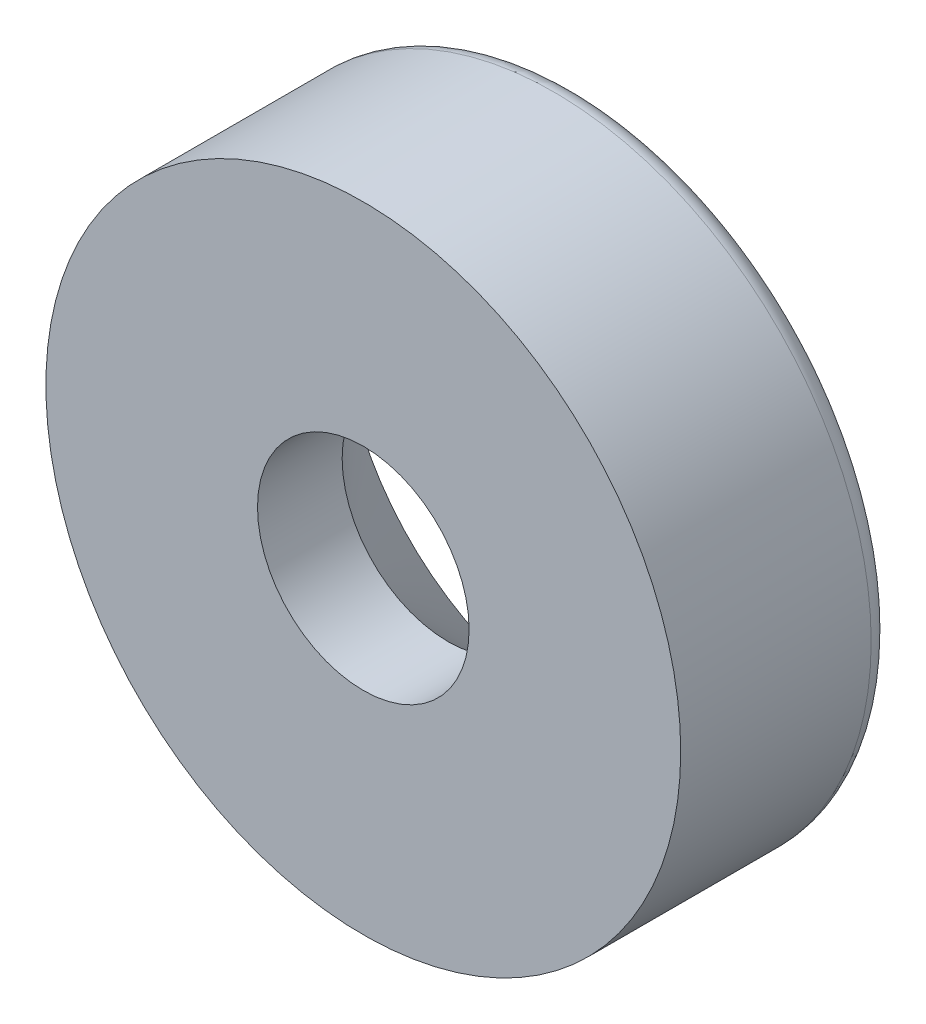
ISO-10303-21;
HEADER;
FILE_DESCRIPTION(('STEP AP214'),'2;1');
FILE_NAME('part.step','',(''),(''),'','','');
FILE_SCHEMA(('AUTOMOTIVE_DESIGN { 1 0 10303 214 1 1 1 1 }'));
ENDSEC;
DATA;
#1=APPLICATION_CONTEXT('core data for automotive mechanical design processes');
#2=APPLICATION_PROTOCOL_DEFINITION('international standard','automotive_design',2000,#1);
#3=PRODUCT_CONTEXT('',#1,'mechanical');
#4=PRODUCT('Part','Part','',(#3));
#5=PRODUCT_RELATED_PRODUCT_CATEGORY('part','',(#4));
#6=PRODUCT_DEFINITION_FORMATION('','',#4);
#7=PRODUCT_DEFINITION_CONTEXT('part definition',#1,'design');
#8=PRODUCT_DEFINITION('design','',#6,#7);
#9=PRODUCT_DEFINITION_SHAPE('','',#8);
#10=(LENGTH_UNIT() NAMED_UNIT(*) SI_UNIT(.MILLI.,.METRE.));
#11=(NAMED_UNIT(*) PLANE_ANGLE_UNIT() SI_UNIT($,.RADIAN.));
#12=(NAMED_UNIT(*) SI_UNIT($,.STERADIAN.) SOLID_ANGLE_UNIT());
#13=UNCERTAINTY_MEASURE_WITH_UNIT(LENGTH_MEASURE(1.E-05),#10,'distance_accuracy_value','');
#14=(GEOMETRIC_REPRESENTATION_CONTEXT(3) GLOBAL_UNCERTAINTY_ASSIGNED_CONTEXT((#13)) GLOBAL_UNIT_ASSIGNED_CONTEXT((#10,
#11,#12)) REPRESENTATION_CONTEXT('',''));
#15=CARTESIAN_POINT('',(0.,0.,0.));
#16=DIRECTION('',(0.,0.,1.));
#17=DIRECTION('',(1.,0.,0.));
#18=AXIS2_PLACEMENT_3D('',#15,#16,#17);
#19=CARTESIAN_POINT('',(0.,0.,2.));
#20=DIRECTION('',(0.,0.,1.));
#21=DIRECTION('',(1.,0.,0.));
#22=AXIS2_PLACEMENT_3D('',#19,#20,#21);
#23=PLANE('',#22);
#24=CARTESIAN_POINT('',(0.,0.,2.));
#25=DIRECTION('',(0.,0.,1.));
#26=DIRECTION('',(1.,0.,0.));
#27=AXIS2_PLACEMENT_3D('',#24,#25,#26);
#28=CIRCLE('',#27,3.);
#29=CARTESIAN_POINT('',(3.,0.,2.));
#30=VERTEX_POINT('',#29);
#31=EDGE_CURVE('E55',#30,#30,#28,.T.);
#32=ORIENTED_EDGE('',*,*,#31,.T.);
#33=EDGE_LOOP('',(#32));
#34=FACE_BOUND('',#33,.T.);
#35=CARTESIAN_POINT('',(0.,0.,2.));
#36=DIRECTION('',(0.,0.,1.));
#37=DIRECTION('',(1.,0.,0.));
#38=AXIS2_PLACEMENT_3D('',#35,#36,#37);
#39=CIRCLE('',#38,1.);
#40=CARTESIAN_POINT('',(1.,0.,2.));
#41=VERTEX_POINT('',#40);
#42=EDGE_CURVE('E58',#41,#41,#39,.T.);
#43=ORIENTED_EDGE('',*,*,#42,.F.);
#44=EDGE_LOOP('',(#43));
#45=FACE_BOUND('',#44,.T.);
#46=ADVANCED_FACE('F35',(#34,#45),#23,.T.);
#47=CARTESIAN_POINT('',(0.,0.,0.));
#48=DIRECTION('',(0.,0.,1.));
#49=DIRECTION('',(1.,0.,0.));
#50=AXIS2_PLACEMENT_3D('',#47,#48,#49);
#51=PLANE('',#50);
#52=CARTESIAN_POINT('',(0.,0.,0.));
#53=DIRECTION('',(0.,0.,1.));
#54=DIRECTION('',(1.,0.,0.));
#55=AXIS2_PLACEMENT_3D('',#52,#53,#54);
#56=CIRCLE('',#55,2.8);
#57=CARTESIAN_POINT('',(2.8,0.,0.));
#58=VERTEX_POINT('',#57);
#59=EDGE_CURVE('E10',#58,#58,#56,.F.);
#60=ORIENTED_EDGE('',*,*,#59,.T.);
#61=EDGE_LOOP('',(#60));
#62=FACE_BOUND('',#61,.T.);
#63=CARTESIAN_POINT('',(0.,0.,0.));
#64=DIRECTION('',(0.,0.,1.));
#65=DIRECTION('',(1.,0.,0.));
#66=AXIS2_PLACEMENT_3D('',#63,#64,#65);
#67=CIRCLE('',#66,2.2);
#68=CARTESIAN_POINT('',(2.2,0.,0.));
#69=VERTEX_POINT('',#68);
#70=EDGE_CURVE('E50',#69,#69,#67,.T.);
#71=ORIENTED_EDGE('',*,*,#70,.T.);
#72=EDGE_LOOP('',(#71));
#73=FACE_BOUND('',#72,.T.);
#74=ADVANCED_FACE('F65',(#62,#73),#51,.F.);
#75=CARTESIAN_POINT('',(0.,0.,2.));
#76=DIRECTION('',(0.,0.,-1.));
#77=DIRECTION('',(-1.,0.,0.));
#78=AXIS2_PLACEMENT_3D('',#75,#76,#77);
#79=CYLINDRICAL_SURFACE('',#78,3.);
#80=CARTESIAN_POINT('',(0.,0.,0.2));
#81=DIRECTION('',(0.,0.,1.));
#82=DIRECTION('',(1.,0.,0.));
#83=AXIS2_PLACEMENT_3D('',#80,#81,#82);
#84=CIRCLE('',#83,3.);
#85=CARTESIAN_POINT('',(3.,0.,0.2));
#86=VERTEX_POINT('',#85);
#87=EDGE_CURVE('E42',#86,#86,#84,.T.);
#88=ORIENTED_EDGE('',*,*,#87,.T.);
#89=EDGE_LOOP('',(#88));
#90=FACE_BOUND('',#89,.T.);
#91=ORIENTED_EDGE('',*,*,#31,.F.);
#92=EDGE_LOOP('',(#91));
#93=FACE_BOUND('',#92,.T.);
#94=ADVANCED_FACE('F71',(#90,#93),#79,.T.);
#95=CARTESIAN_POINT('',(0.,0.,2.));
#96=DIRECTION('',(0.,0.,-1.));
#97=DIRECTION('',(-1.,0.,0.));
#98=AXIS2_PLACEMENT_3D('',#95,#96,#97);
#99=CYLINDRICAL_SURFACE('',#98,1.);
#100=CARTESIAN_POINT('',(0.,0.,1.2));
#101=DIRECTION('',(0.,0.,1.));
#102=DIRECTION('',(1.,0.,0.));
#103=AXIS2_PLACEMENT_3D('',#100,#101,#102);
#104=CIRCLE('',#103,1.);
#105=CARTESIAN_POINT('',(1.,0.,1.2));
#106=VERTEX_POINT('',#105);
#107=EDGE_CURVE('E46',#106,#106,#104,.F.);
#108=ORIENTED_EDGE('',*,*,#107,.T.);
#109=EDGE_LOOP('',(#108));
#110=FACE_BOUND('',#109,.T.);
#111=ORIENTED_EDGE('',*,*,#42,.T.);
#112=EDGE_LOOP('',(#111));
#113=FACE_BOUND('',#112,.T.);
#114=ADVANCED_FACE('F62',(#110,#113),#99,.F.);
#115=CARTESIAN_POINT('',(0.,0.,0.));
#116=DIRECTION('',(0.,0.,-1.));
#117=DIRECTION('',(-1.,0.,0.));
#118=AXIS2_PLACEMENT_3D('',#115,#116,#117);
#119=CONICAL_SURFACE('',#118,2.2,0.785398163397447);
#120=ORIENTED_EDGE('',*,*,#107,.F.);
#121=EDGE_LOOP('',(#120));
#122=FACE_BOUND('',#121,.T.);
#123=ORIENTED_EDGE('',*,*,#70,.F.);
#124=EDGE_LOOP('',(#123));
#125=FACE_BOUND('',#124,.T.);
#126=ADVANCED_FACE('F77',(#122,#125),#119,.F.);
#127=CARTESIAN_POINT('',(0.,0.,0.2));
#128=DIRECTION('',(0.,0.,1.));
#129=DIRECTION('',(1.,0.,0.));
#130=AXIS2_PLACEMENT_3D('',#127,#128,#129);
#131=TOROIDAL_SURFACE('',#130,2.8,0.2);
#132=ORIENTED_EDGE('',*,*,#59,.F.);
#133=EDGE_LOOP('',(#132));
#134=FACE_BOUND('',#133,.T.);
#135=ORIENTED_EDGE('',*,*,#87,.F.);
#136=EDGE_LOOP('',(#135));
#137=FACE_BOUND('',#136,.T.);
#138=ADVANCED_FACE('F37',(#134,#137),#131,.T.);
#139=CLOSED_SHELL('',(#46,#74,#94,#114,#126,#138));
#140=MANIFOLD_SOLID_BREP('B2',#139);
#141=ADVANCED_BREP_SHAPE_REPRESENTATION('',(#18,#140),#14);
#142=SHAPE_DEFINITION_REPRESENTATION(#9,#141);
ENDSEC;
END-ISO-10303-21;
